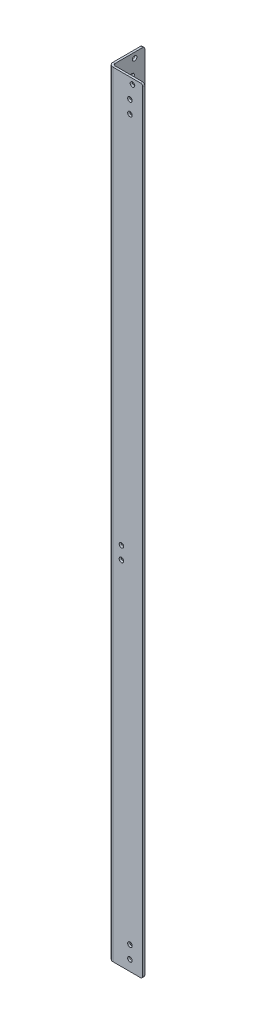
ISO-10303-21;
HEADER;
FILE_DESCRIPTION(('STEP AP214'),'2;1');
FILE_NAME('part.step','',(''),(''),'','','');
FILE_SCHEMA(('AUTOMOTIVE_DESIGN { 1 0 10303 214 1 1 1 1 }'));
ENDSEC;
DATA;
#1=APPLICATION_CONTEXT('core data for automotive mechanical design processes');
#2=APPLICATION_PROTOCOL_DEFINITION('international standard','automotive_design',2000,#1);
#3=PRODUCT_CONTEXT('',#1,'mechanical');
#4=PRODUCT('Part','Part','',(#3));
#5=PRODUCT_RELATED_PRODUCT_CATEGORY('part','',(#4));
#6=PRODUCT_DEFINITION_FORMATION('','',#4);
#7=PRODUCT_DEFINITION_CONTEXT('part definition',#1,'design');
#8=PRODUCT_DEFINITION('design','',#6,#7);
#9=PRODUCT_DEFINITION_SHAPE('','',#8);
#10=(LENGTH_UNIT() NAMED_UNIT(*) SI_UNIT(.MILLI.,.METRE.));
#11=(NAMED_UNIT(*) PLANE_ANGLE_UNIT() SI_UNIT($,.RADIAN.));
#12=(NAMED_UNIT(*) SI_UNIT($,.STERADIAN.) SOLID_ANGLE_UNIT());
#13=UNCERTAINTY_MEASURE_WITH_UNIT(LENGTH_MEASURE(1.E-05),#10,'distance_accuracy_value','');
#14=(GEOMETRIC_REPRESENTATION_CONTEXT(3) GLOBAL_UNCERTAINTY_ASSIGNED_CONTEXT((#13)) GLOBAL_UNIT_ASSIGNED_CONTEXT((#10,
#11,#12)) REPRESENTATION_CONTEXT('',''));
#15=CARTESIAN_POINT('',(0.,0.,0.));
#16=DIRECTION('',(0.,0.,1.));
#17=DIRECTION('',(1.,0.,0.));
#18=AXIS2_PLACEMENT_3D('',#15,#16,#17);
#19=CARTESIAN_POINT('',(0.,1159.383,-6.35));
#20=DIRECTION('',(0.,1.,0.));
#21=DIRECTION('',(0.,0.,1.));
#22=AXIS2_PLACEMENT_3D('',#19,#20,#21);
#23=PLANE('',#22);
#24=DIRECTION('',(1.,0.,0.));
#25=VECTOR('',#24,1.);
#26=CARTESIAN_POINT('',(0.,1159.383,-6.35));
#27=LINE('',#26,#25);
#28=CARTESIAN_POINT('',(0.,1159.383,-6.35));
#29=VERTEX_POINT('',#28);
#30=CARTESIAN_POINT('',(3.175,1159.383,-6.35));
#31=VERTEX_POINT('',#30);
#32=EDGE_CURVE('E293',#29,#31,#27,.T.);
#33=ORIENTED_EDGE('',*,*,#32,.F.);
#34=CARTESIAN_POINT('',(6.35,1159.383,-6.35));
#35=DIRECTION('',(0.,-1.,0.));
#36=DIRECTION('',(0.,0.,-1.));
#37=AXIS2_PLACEMENT_3D('',#34,#35,#36);
#38=CIRCLE('',#37,6.35);
#39=CARTESIAN_POINT('',(6.35,1159.383,0.));
#40=VERTEX_POINT('',#39);
#41=EDGE_CURVE('E290',#29,#40,#38,.F.);
#42=ORIENTED_EDGE('',*,*,#41,.T.);
#43=DIRECTION('',(0.,0.,1.));
#44=VECTOR('',#43,1.);
#45=CARTESIAN_POINT('',(6.35,1159.383,-3.175));
#46=LINE('',#45,#44);
#47=CARTESIAN_POINT('',(6.35,1159.383,-3.175));
#48=VERTEX_POINT('',#47);
#49=EDGE_CURVE('E284',#48,#40,#46,.T.);
#50=ORIENTED_EDGE('',*,*,#49,.F.);
#51=CARTESIAN_POINT('',(6.35,1159.383,-6.35));
#52=DIRECTION('',(0.,1.,0.));
#53=DIRECTION('',(1.,0.,0.));
#54=AXIS2_PLACEMENT_3D('',#51,#52,#53);
#55=CIRCLE('',#54,3.175);
#56=EDGE_CURVE('E288',#31,#48,#55,.T.);
#57=ORIENTED_EDGE('',*,*,#56,.F.);
#58=EDGE_LOOP('',(#33,#42,#50,#57));
#59=FACE_BOUND('',#58,.T.);
#60=ADVANCED_FACE('F192',(#59),#23,.T.);
#61=CARTESIAN_POINT('',(6.35,1159.383,-3.175));
#62=DIRECTION('',(0.,1.,0.));
#63=DIRECTION('',(0.,0.,1.));
#64=AXIS2_PLACEMENT_3D('',#61,#62,#63);
#65=PLANE('',#64);
#66=DIRECTION('',(0.,0.,-1.));
#67=VECTOR('',#66,1.);
#68=CARTESIAN_POINT('',(3.175,1159.383,-50.8));
#69=LINE('',#68,#67);
#70=CARTESIAN_POINT('',(3.175,1159.383,-47.625));
#71=VERTEX_POINT('',#70);
#72=EDGE_CURVE('E320',#71,#31,#69,.F.);
#73=ORIENTED_EDGE('',*,*,#72,.F.);
#74=DIRECTION('',(1.,0.,0.));
#75=VECTOR('',#74,1.);
#76=CARTESIAN_POINT('',(6.35,1159.383,-47.625));
#77=LINE('',#76,#75);
#78=CARTESIAN_POINT('',(0.,1159.383,-47.625));
#79=VERTEX_POINT('',#78);
#80=EDGE_CURVE('E397',#71,#79,#77,.F.);
#81=ORIENTED_EDGE('',*,*,#80,.T.);
#82=DIRECTION('',(0.,0.,1.));
#83=VECTOR('',#82,1.);
#84=CARTESIAN_POINT('',(0.,1159.383,-50.8));
#85=LINE('',#84,#83);
#86=EDGE_CURVE('E324',#79,#29,#85,.T.);
#87=ORIENTED_EDGE('',*,*,#86,.T.);
#88=ORIENTED_EDGE('',*,*,#32,.T.);
#89=EDGE_LOOP('',(#73,#81,#87,#88));
#90=FACE_BOUND('',#89,.T.);
#91=ADVANCED_FACE('F616',(#90),#65,.T.);
#92=CARTESIAN_POINT('',(6.35,0.,0.));
#93=DIRECTION('',(0.,-1.,0.));
#94=DIRECTION('',(0.,0.,-1.));
#95=AXIS2_PLACEMENT_3D('',#92,#93,#94);
#96=PLANE('',#95);
#97=DIRECTION('',(0.,0.,-1.));
#98=VECTOR('',#97,1.);
#99=CARTESIAN_POINT('',(6.35,0.,0.));
#100=LINE('',#99,#98);
#101=CARTESIAN_POINT('',(6.35,0.,0.));
#102=VERTEX_POINT('',#101);
#103=CARTESIAN_POINT('',(6.35,0.,-3.175));
#104=VERTEX_POINT('',#103);
#105=EDGE_CURVE('E294',#102,#104,#100,.T.);
#106=ORIENTED_EDGE('',*,*,#105,.F.);
#107=CARTESIAN_POINT('',(6.35,0.,-6.35));
#108=DIRECTION('',(0.,-1.,0.));
#109=DIRECTION('',(0.,0.,-1.));
#110=AXIS2_PLACEMENT_3D('',#107,#108,#109);
#111=CIRCLE('',#110,6.35);
#112=CARTESIAN_POINT('',(0.,0.,-6.35));
#113=VERTEX_POINT('',#112);
#114=EDGE_CURVE('E349',#113,#102,#111,.F.);
#115=ORIENTED_EDGE('',*,*,#114,.F.);
#116=DIRECTION('',(-1.,0.,0.));
#117=VECTOR('',#116,1.);
#118=CARTESIAN_POINT('',(3.175,0.,-6.35));
#119=LINE('',#118,#117);
#120=CARTESIAN_POINT('',(3.175,0.,-6.35));
#121=VERTEX_POINT('',#120);
#122=EDGE_CURVE('E375',#121,#113,#119,.T.);
#123=ORIENTED_EDGE('',*,*,#122,.F.);
#124=CARTESIAN_POINT('',(6.35,0.,-6.35));
#125=DIRECTION('',(0.,1.,0.));
#126=DIRECTION('',(1.,0.,0.));
#127=AXIS2_PLACEMENT_3D('',#124,#125,#126);
#128=CIRCLE('',#127,3.175);
#129=EDGE_CURVE('E340',#121,#104,#128,.T.);
#130=ORIENTED_EDGE('',*,*,#129,.T.);
#131=EDGE_LOOP('',(#106,#115,#123,#130));
#132=FACE_BOUND('',#131,.T.);
#133=ADVANCED_FACE('F614',(#132),#96,.T.);
#134=CARTESIAN_POINT('',(3.175,0.,-6.35));
#135=DIRECTION('',(0.,-1.,0.));
#136=DIRECTION('',(0.,0.,-1.));
#137=AXIS2_PLACEMENT_3D('',#134,#135,#136);
#138=PLANE('',#137);
#139=DIRECTION('',(1.,0.,0.));
#140=VECTOR('',#139,1.);
#141=CARTESIAN_POINT('',(0.,0.,-3.175));
#142=LINE('',#141,#140);
#143=CARTESIAN_POINT('',(47.625,0.,-3.175));
#144=VERTEX_POINT('',#143);
#145=EDGE_CURVE('E304',#104,#144,#142,.T.);
#146=ORIENTED_EDGE('',*,*,#145,.T.);
#147=DIRECTION('',(0.,0.,1.));
#148=VECTOR('',#147,1.);
#149=CARTESIAN_POINT('',(47.625,0.,-6.35));
#150=LINE('',#149,#148);
#151=CARTESIAN_POINT('',(47.625,0.,0.));
#152=VERTEX_POINT('',#151);
#153=EDGE_CURVE('E410',#144,#152,#150,.T.);
#154=ORIENTED_EDGE('',*,*,#153,.T.);
#155=DIRECTION('',(1.,0.,0.));
#156=VECTOR('',#155,1.);
#157=CARTESIAN_POINT('',(0.,0.,0.));
#158=LINE('',#157,#156);
#159=EDGE_CURVE('E333',#102,#152,#158,.T.);
#160=ORIENTED_EDGE('',*,*,#159,.F.);
#161=ORIENTED_EDGE('',*,*,#105,.T.);
#162=EDGE_LOOP('',(#146,#154,#160,#161));
#163=FACE_BOUND('',#162,.T.);
#164=ADVANCED_FACE('F434',(#163),#138,.T.);
#165=CARTESIAN_POINT('',(0.,1159.383,0.));
#166=DIRECTION('',(0.,0.,-1.));
#167=DIRECTION('',(-1.,0.,0.));
#168=AXIS2_PLACEMENT_3D('',#165,#166,#167);
#169=PLANE('',#168);
#170=CARTESIAN_POINT('',(31.75,1130.173,0.));
#171=DIRECTION('',(0.,0.,1.));
#172=DIRECTION('',(1.,0.,0.));
#173=AXIS2_PLACEMENT_3D('',#170,#171,#172);
#174=CIRCLE('',#173,3.42899999999998);
#175=CARTESIAN_POINT('',(35.179,1130.173,0.));
#176=VERTEX_POINT('',#175);
#177=EDGE_CURVE('E471',#176,#176,#174,.T.);
#178=ORIENTED_EDGE('',*,*,#177,.F.);
#179=EDGE_LOOP('',(#178));
#180=FACE_BOUND('',#179,.T.);
#181=CARTESIAN_POINT('',(19.05,527.05,0.));
#182=DIRECTION('',(0.,0.,1.));
#183=DIRECTION('',(1.,0.,0.));
#184=AXIS2_PLACEMENT_3D('',#181,#182,#183);
#185=CIRCLE('',#184,3.429);
#186=CARTESIAN_POINT('',(22.479,527.05,0.));
#187=VERTEX_POINT('',#186);
#188=EDGE_CURVE('E480',#187,#187,#185,.T.);
#189=ORIENTED_EDGE('',*,*,#188,.F.);
#190=EDGE_LOOP('',(#189));
#191=FACE_BOUND('',#190,.T.);
#192=CARTESIAN_POINT('',(19.05,546.1,0.));
#193=DIRECTION('',(0.,0.,1.));
#194=DIRECTION('',(1.,0.,0.));
#195=AXIS2_PLACEMENT_3D('',#192,#193,#194);
#196=CIRCLE('',#195,3.429);
#197=CARTESIAN_POINT('',(22.479,546.1,0.));
#198=VERTEX_POINT('',#197);
#199=EDGE_CURVE('E455',#198,#198,#196,.T.);
#200=ORIENTED_EDGE('',*,*,#199,.F.);
#201=EDGE_LOOP('',(#200));
#202=FACE_BOUND('',#201,.T.);
#203=CARTESIAN_POINT('',(31.75,15.875,0.));
#204=DIRECTION('',(0.,0.,1.));
#205=DIRECTION('',(1.,0.,0.));
#206=AXIS2_PLACEMENT_3D('',#203,#204,#205);
#207=CIRCLE('',#206,3.429);
#208=CARTESIAN_POINT('',(35.179,15.875,0.));
#209=VERTEX_POINT('',#208);
#210=EDGE_CURVE('E464',#209,#209,#207,.T.);
#211=ORIENTED_EDGE('',*,*,#210,.F.);
#212=EDGE_LOOP('',(#211));
#213=FACE_BOUND('',#212,.T.);
#214=CARTESIAN_POINT('',(31.75,1111.123,0.));
#215=DIRECTION('',(0.,0.,1.));
#216=DIRECTION('',(1.,0.,0.));
#217=AXIS2_PLACEMENT_3D('',#214,#215,#216);
#218=CIRCLE('',#217,3.42899999999998);
#219=CARTESIAN_POINT('',(35.179,1111.123,0.));
#220=VERTEX_POINT('',#219);
#221=EDGE_CURVE('E496',#220,#220,#218,.T.);
#222=ORIENTED_EDGE('',*,*,#221,.F.);
#223=EDGE_LOOP('',(#222));
#224=FACE_BOUND('',#223,.T.);
#225=CARTESIAN_POINT('',(35.56,1151.4455,0.));
#226=DIRECTION('',(0.,0.,1.));
#227=DIRECTION('',(1.,0.,0.));
#228=AXIS2_PLACEMENT_3D('',#225,#226,#227);
#229=CIRCLE('',#228,3.42899999999999);
#230=CARTESIAN_POINT('',(38.989,1151.4455,0.));
#231=VERTEX_POINT('',#230);
#232=EDGE_CURVE('E487',#231,#231,#229,.T.);
#233=ORIENTED_EDGE('',*,*,#232,.F.);
#234=EDGE_LOOP('',(#233));
#235=FACE_BOUND('',#234,.T.);
#236=CARTESIAN_POINT('',(31.75,34.925,0.));
#237=DIRECTION('',(0.,0.,1.));
#238=DIRECTION('',(1.,0.,0.));
#239=AXIS2_PLACEMENT_3D('',#236,#237,#238);
#240=CIRCLE('',#239,3.429);
#241=CARTESIAN_POINT('',(35.179,34.925,0.));
#242=VERTEX_POINT('',#241);
#243=EDGE_CURVE('E447',#242,#242,#240,.T.);
#244=ORIENTED_EDGE('',*,*,#243,.F.);
#245=EDGE_LOOP('',(#244));
#246=FACE_BOUND('',#245,.T.);
#247=ORIENTED_EDGE('',*,*,#159,.T.);
#248=CARTESIAN_POINT('',(47.625,3.175,0.));
#249=DIRECTION('',(0.,0.,-1.));
#250=DIRECTION('',(-1.,0.,0.));
#251=AXIS2_PLACEMENT_3D('',#248,#249,#250);
#252=CIRCLE('',#251,3.175);
#253=CARTESIAN_POINT('',(50.8,3.17499999999993,0.));
#254=VERTEX_POINT('',#253);
#255=EDGE_CURVE('E417',#152,#254,#252,.F.);
#256=ORIENTED_EDGE('',*,*,#255,.T.);
#257=DIRECTION('',(0.,-1.,0.));
#258=VECTOR('',#257,1.);
#259=CARTESIAN_POINT('',(50.8,1159.383,0.));
#260=LINE('',#259,#258);
#261=CARTESIAN_POINT('',(50.8,1156.208,0.));
#262=VERTEX_POINT('',#261);
#263=EDGE_CURVE('E372',#262,#254,#260,.T.);
#264=ORIENTED_EDGE('',*,*,#263,.F.);
#265=CARTESIAN_POINT('',(47.625,1156.208,0.));
#266=DIRECTION('',(0.,0.,-1.));
#267=DIRECTION('',(-1.,0.,0.));
#268=AXIS2_PLACEMENT_3D('',#265,#266,#267);
#269=CIRCLE('',#268,3.175);
#270=CARTESIAN_POINT('',(47.625,1159.383,0.));
#271=VERTEX_POINT('',#270);
#272=EDGE_CURVE('E414',#262,#271,#269,.F.);
#273=ORIENTED_EDGE('',*,*,#272,.T.);
#274=DIRECTION('',(1.,0.,0.));
#275=VECTOR('',#274,1.);
#276=CARTESIAN_POINT('',(0.,1159.383,0.));
#277=LINE('',#276,#275);
#278=EDGE_CURVE('E314',#40,#271,#277,.T.);
#279=ORIENTED_EDGE('',*,*,#278,.F.);
#280=DIRECTION('',(0.,-1.,0.));
#281=VECTOR('',#280,1.);
#282=CARTESIAN_POINT('',(6.35,1159.383,0.));
#283=LINE('',#282,#281);
#284=EDGE_CURVE('E332',#40,#102,#283,.T.);
#285=ORIENTED_EDGE('',*,*,#284,.T.);
#286=EDGE_LOOP('',(#247,#256,#264,#273,#279,#285));
#287=FACE_BOUND('',#286,.T.);
#288=ADVANCED_FACE('F439',(#180,#191,#202,#213,#224,#235,#246,#287),#169,.F.);
#289=CARTESIAN_POINT('',(50.8,1159.383,-3.175));
#290=DIRECTION('',(1.,0.,0.));
#291=DIRECTION('',(0.,0.,-1.));
#292=AXIS2_PLACEMENT_3D('',#289,#290,#291);
#293=PLANE('',#292);
#294=ORIENTED_EDGE('',*,*,#263,.T.);
#295=DIRECTION('',(0.,0.,1.));
#296=VECTOR('',#295,1.);
#297=CARTESIAN_POINT('',(50.8,3.17499999999993,-3.175));
#298=LINE('',#297,#296);
#299=CARTESIAN_POINT('',(50.8,3.17499999999993,-3.175));
#300=VERTEX_POINT('',#299);
#301=EDGE_CURVE('E214',#254,#300,#298,.F.);
#302=ORIENTED_EDGE('',*,*,#301,.T.);
#303=DIRECTION('',(0.,-1.,0.));
#304=VECTOR('',#303,1.);
#305=CARTESIAN_POINT('',(50.8,1159.383,-3.175));
#306=LINE('',#305,#304);
#307=CARTESIAN_POINT('',(50.8,1156.208,-3.175));
#308=VERTEX_POINT('',#307);
#309=EDGE_CURVE('E309',#308,#300,#306,.T.);
#310=ORIENTED_EDGE('',*,*,#309,.F.);
#311=DIRECTION('',(0.,0.,1.));
#312=VECTOR('',#311,1.);
#313=CARTESIAN_POINT('',(50.8,1156.208,-3.175));
#314=LINE('',#313,#312);
#315=EDGE_CURVE('E420',#308,#262,#314,.T.);
#316=ORIENTED_EDGE('',*,*,#315,.T.);
#317=EDGE_LOOP('',(#294,#302,#310,#316));
#318=FACE_BOUND('',#317,.T.);
#319=ADVANCED_FACE('F440',(#318),#293,.T.);
#320=CARTESIAN_POINT('',(0.,1159.383,-3.175));
#321=DIRECTION('',(0.,0.,-1.));
#322=DIRECTION('',(-1.,0.,0.));
#323=AXIS2_PLACEMENT_3D('',#320,#321,#322);
#324=PLANE('',#323);
#325=CARTESIAN_POINT('',(31.75,1130.173,-3.175));
#326=DIRECTION('',(0.,0.,1.));
#327=DIRECTION('',(1.,0.,0.));
#328=AXIS2_PLACEMENT_3D('',#325,#326,#327);
#329=CIRCLE('',#328,3.42899999999998);
#330=CARTESIAN_POINT('',(35.179,1130.173,-3.175));
#331=VERTEX_POINT('',#330);
#332=EDGE_CURVE('E475',#331,#331,#329,.T.);
#333=ORIENTED_EDGE('',*,*,#332,.T.);
#334=EDGE_LOOP('',(#333));
#335=FACE_BOUND('',#334,.T.);
#336=CARTESIAN_POINT('',(19.05,527.05,-3.175));
#337=DIRECTION('',(0.,0.,1.));
#338=DIRECTION('',(1.,0.,0.));
#339=AXIS2_PLACEMENT_3D('',#336,#337,#338);
#340=CIRCLE('',#339,3.429);
#341=CARTESIAN_POINT('',(22.479,527.05,-3.175));
#342=VERTEX_POINT('',#341);
#343=EDGE_CURVE('E460',#342,#342,#340,.T.);
#344=ORIENTED_EDGE('',*,*,#343,.T.);
#345=EDGE_LOOP('',(#344));
#346=FACE_BOUND('',#345,.T.);
#347=CARTESIAN_POINT('',(19.05,546.1,-3.175));
#348=DIRECTION('',(0.,0.,1.));
#349=DIRECTION('',(1.,0.,0.));
#350=AXIS2_PLACEMENT_3D('',#347,#348,#349);
#351=CIRCLE('',#350,3.429);
#352=CARTESIAN_POINT('',(22.479,546.1,-3.175));
#353=VERTEX_POINT('',#352);
#354=EDGE_CURVE('E459',#353,#353,#351,.T.);
#355=ORIENTED_EDGE('',*,*,#354,.T.);
#356=EDGE_LOOP('',(#355));
#357=FACE_BOUND('',#356,.T.);
#358=CARTESIAN_POINT('',(31.75,15.875,-3.175));
#359=DIRECTION('',(0.,0.,1.));
#360=DIRECTION('',(1.,0.,0.));
#361=AXIS2_PLACEMENT_3D('',#358,#359,#360);
#362=CIRCLE('',#361,3.429);
#363=CARTESIAN_POINT('',(35.179,15.875,-3.175));
#364=VERTEX_POINT('',#363);
#365=EDGE_CURVE('E451',#364,#364,#362,.T.);
#366=ORIENTED_EDGE('',*,*,#365,.T.);
#367=EDGE_LOOP('',(#366));
#368=FACE_BOUND('',#367,.T.);
#369=CARTESIAN_POINT('',(31.75,1111.123,-3.175));
#370=DIRECTION('',(0.,0.,1.));
#371=DIRECTION('',(1.,0.,0.));
#372=AXIS2_PLACEMENT_3D('',#369,#370,#371);
#373=CIRCLE('',#372,3.42899999999998);
#374=CARTESIAN_POINT('',(35.179,1111.123,-3.175));
#375=VERTEX_POINT('',#374);
#376=EDGE_CURVE('E476',#375,#375,#373,.T.);
#377=ORIENTED_EDGE('',*,*,#376,.T.);
#378=EDGE_LOOP('',(#377));
#379=FACE_BOUND('',#378,.T.);
#380=CARTESIAN_POINT('',(35.56,1151.4455,-3.175));
#381=DIRECTION('',(0.,0.,1.));
#382=DIRECTION('',(1.,0.,0.));
#383=AXIS2_PLACEMENT_3D('',#380,#381,#382);
#384=CIRCLE('',#383,3.42899999999999);
#385=CARTESIAN_POINT('',(38.989,1151.4455,-3.175));
#386=VERTEX_POINT('',#385);
#387=EDGE_CURVE('E491',#386,#386,#384,.T.);
#388=ORIENTED_EDGE('',*,*,#387,.T.);
#389=EDGE_LOOP('',(#388));
#390=FACE_BOUND('',#389,.T.);
#391=CARTESIAN_POINT('',(31.75,34.925,-3.175));
#392=DIRECTION('',(0.,0.,1.));
#393=DIRECTION('',(1.,0.,0.));
#394=AXIS2_PLACEMENT_3D('',#391,#392,#393);
#395=CIRCLE('',#394,3.429);
#396=CARTESIAN_POINT('',(35.179,34.925,-3.175));
#397=VERTEX_POINT('',#396);
#398=EDGE_CURVE('E337',#397,#397,#395,.T.);
#399=ORIENTED_EDGE('',*,*,#398,.T.);
#400=EDGE_LOOP('',(#399));
#401=FACE_BOUND('',#400,.T.);
#402=ORIENTED_EDGE('',*,*,#309,.T.);
#403=CARTESIAN_POINT('',(47.625,3.175,-3.175));
#404=DIRECTION('',(0.,0.,-1.));
#405=DIRECTION('',(-1.,0.,0.));
#406=AXIS2_PLACEMENT_3D('',#403,#404,#405);
#407=CIRCLE('',#406,3.175);
#408=EDGE_CURVE('E201',#300,#144,#407,.T.);
#409=ORIENTED_EDGE('',*,*,#408,.T.);
#410=ORIENTED_EDGE('',*,*,#145,.F.);
#411=DIRECTION('',(0.,-1.,0.));
#412=VECTOR('',#411,1.);
#413=CARTESIAN_POINT('',(6.35,1159.383,-3.175));
#414=LINE('',#413,#412);
#415=EDGE_CURVE('E299',#48,#104,#414,.T.);
#416=ORIENTED_EDGE('',*,*,#415,.F.);
#417=DIRECTION('',(1.,0.,0.));
#418=VECTOR('',#417,1.);
#419=CARTESIAN_POINT('',(0.,1159.383,-3.175));
#420=LINE('',#419,#418);
#421=CARTESIAN_POINT('',(47.625,1159.383,-3.175));
#422=VERTEX_POINT('',#421);
#423=EDGE_CURVE('E301',#48,#422,#420,.T.);
#424=ORIENTED_EDGE('',*,*,#423,.T.);
#425=CARTESIAN_POINT('',(47.625,1156.208,-3.175));
#426=DIRECTION('',(0.,0.,-1.));
#427=DIRECTION('',(-1.,0.,0.));
#428=AXIS2_PLACEMENT_3D('',#425,#426,#427);
#429=CIRCLE('',#428,3.175);
#430=EDGE_CURVE('E426',#422,#308,#429,.T.);
#431=ORIENTED_EDGE('',*,*,#430,.T.);
#432=EDGE_LOOP('',(#402,#409,#410,#416,#424,#431));
#433=FACE_BOUND('',#432,.T.);
#434=ADVANCED_FACE('F300',(#335,#346,#357,#368,#379,#390,#401,#433),#324,.T.);
#435=CARTESIAN_POINT('',(6.35,1159.383,-6.35));
#436=DIRECTION('',(0.,-1.,0.));
#437=DIRECTION('',(0.,0.,-1.));
#438=AXIS2_PLACEMENT_3D('',#435,#436,#437);
#439=CYLINDRICAL_SURFACE('',#438,3.175);
#440=ORIENTED_EDGE('',*,*,#129,.F.);
#441=DIRECTION('',(0.,-1.,0.));
#442=VECTOR('',#441,1.);
#443=CARTESIAN_POINT('',(3.175,1159.383,-6.35));
#444=LINE('',#443,#442);
#445=EDGE_CURVE('E310',#31,#121,#444,.T.);
#446=ORIENTED_EDGE('',*,*,#445,.F.);
#447=ORIENTED_EDGE('',*,*,#56,.T.);
#448=ORIENTED_EDGE('',*,*,#415,.T.);
#449=EDGE_LOOP('',(#440,#446,#447,#448));
#450=FACE_BOUND('',#449,.T.);
#451=ADVANCED_FACE('F317',(#450),#439,.F.);
#452=CARTESIAN_POINT('',(3.175,1159.383,-50.8));
#453=DIRECTION('',(1.,0.,0.));
#454=DIRECTION('',(0.,0.,-1.));
#455=AXIS2_PLACEMENT_3D('',#452,#453,#454);
#456=PLANE('',#455);
#457=CARTESIAN_POINT('',(3.175,1151.4455,-35.56));
#458=DIRECTION('',(-1.,0.,0.));
#459=DIRECTION('',(0.,0.,1.));
#460=AXIS2_PLACEMENT_3D('',#457,#458,#459);
#461=CIRCLE('',#460,3.42899999999999);
#462=CARTESIAN_POINT('',(3.175,1151.4455,-32.131));
#463=VERTEX_POINT('',#462);
#464=EDGE_CURVE('E492',#463,#463,#461,.T.);
#465=ORIENTED_EDGE('',*,*,#464,.T.);
#466=EDGE_LOOP('',(#465));
#467=FACE_BOUND('',#466,.T.);
#468=CARTESIAN_POINT('',(3.175,34.925,-31.75));
#469=DIRECTION('',(-1.,0.,0.));
#470=DIRECTION('',(0.,0.,1.));
#471=AXIS2_PLACEMENT_3D('',#468,#469,#470);
#472=CIRCLE('',#471,3.429);
#473=CARTESIAN_POINT('',(3.175,34.925,-28.321));
#474=VERTEX_POINT('',#473);
#475=EDGE_CURVE('E547',#474,#474,#472,.T.);
#476=ORIENTED_EDGE('',*,*,#475,.T.);
#477=EDGE_LOOP('',(#476));
#478=FACE_BOUND('',#477,.T.);
#479=CARTESIAN_POINT('',(3.175,15.875,-31.75));
#480=DIRECTION('',(-1.,0.,0.));
#481=DIRECTION('',(0.,0.,1.));
#482=AXIS2_PLACEMENT_3D('',#479,#480,#481);
#483=CIRCLE('',#482,3.429);
#484=CARTESIAN_POINT('',(3.175,15.875,-28.321));
#485=VERTEX_POINT('',#484);
#486=EDGE_CURVE('E539',#485,#485,#483,.T.);
#487=ORIENTED_EDGE('',*,*,#486,.T.);
#488=EDGE_LOOP('',(#487));
#489=FACE_BOUND('',#488,.T.);
#490=CARTESIAN_POINT('',(3.175,546.1,-19.05));
#491=DIRECTION('',(-1.,0.,0.));
#492=DIRECTION('',(0.,0.,1.));
#493=AXIS2_PLACEMENT_3D('',#490,#491,#492);
#494=CIRCLE('',#493,3.42899999999999);
#495=CARTESIAN_POINT('',(3.175,546.1,-15.621));
#496=VERTEX_POINT('',#495);
#497=EDGE_CURVE('E531',#496,#496,#494,.T.);
#498=ORIENTED_EDGE('',*,*,#497,.T.);
#499=EDGE_LOOP('',(#498));
#500=FACE_BOUND('',#499,.T.);
#501=CARTESIAN_POINT('',(3.175,527.05,-19.05));
#502=DIRECTION('',(-1.,0.,0.));
#503=DIRECTION('',(0.,0.,1.));
#504=AXIS2_PLACEMENT_3D('',#501,#502,#503);
#505=CIRCLE('',#504,3.42899999999999);
#506=CARTESIAN_POINT('',(3.175,527.05,-15.621));
#507=VERTEX_POINT('',#506);
#508=EDGE_CURVE('E523',#507,#507,#505,.T.);
#509=ORIENTED_EDGE('',*,*,#508,.T.);
#510=EDGE_LOOP('',(#509));
#511=FACE_BOUND('',#510,.T.);
#512=CARTESIAN_POINT('',(3.175,1130.173,-31.75));
#513=DIRECTION('',(-1.,0.,0.));
#514=DIRECTION('',(0.,0.,1.));
#515=AXIS2_PLACEMENT_3D('',#512,#513,#514);
#516=CIRCLE('',#515,3.429);
#517=CARTESIAN_POINT('',(3.175,1130.173,-28.321));
#518=VERTEX_POINT('',#517);
#519=EDGE_CURVE('E515',#518,#518,#516,.T.);
#520=ORIENTED_EDGE('',*,*,#519,.T.);
#521=EDGE_LOOP('',(#520));
#522=FACE_BOUND('',#521,.T.);
#523=CARTESIAN_POINT('',(3.175,1111.123,-31.75));
#524=DIRECTION('',(-1.,0.,0.));
#525=DIRECTION('',(0.,0.,1.));
#526=AXIS2_PLACEMENT_3D('',#523,#524,#525);
#527=CIRCLE('',#526,3.429);
#528=CARTESIAN_POINT('',(3.175,1111.123,-28.321));
#529=VERTEX_POINT('',#528);
#530=EDGE_CURVE('E507',#529,#529,#527,.T.);
#531=ORIENTED_EDGE('',*,*,#530,.T.);
#532=EDGE_LOOP('',(#531));
#533=FACE_BOUND('',#532,.T.);
#534=DIRECTION('',(0.,-1.,0.));
#535=VECTOR('',#534,1.);
#536=CARTESIAN_POINT('',(3.175,1159.383,-50.8));
#537=LINE('',#536,#535);
#538=CARTESIAN_POINT('',(3.175,1156.208,-50.8));
#539=VERTEX_POINT('',#538);
#540=CARTESIAN_POINT('',(3.175,3.17499999999993,-50.8));
#541=VERTEX_POINT('',#540);
#542=EDGE_CURVE('E364',#539,#541,#537,.T.);
#543=ORIENTED_EDGE('',*,*,#542,.F.);
#544=CARTESIAN_POINT('',(3.175,1156.208,-47.625));
#545=DIRECTION('',(1.,0.,0.));
#546=DIRECTION('',(0.,0.,-1.));
#547=AXIS2_PLACEMENT_3D('',#544,#545,#546);
#548=CIRCLE('',#547,3.175);
#549=EDGE_CURVE('E394',#539,#71,#548,.T.);
#550=ORIENTED_EDGE('',*,*,#549,.T.);
#551=ORIENTED_EDGE('',*,*,#72,.T.);
#552=ORIENTED_EDGE('',*,*,#445,.T.);
#553=DIRECTION('',(0.,0.,-1.));
#554=VECTOR('',#553,1.);
#555=CARTESIAN_POINT('',(3.175,0.,-50.8));
#556=LINE('',#555,#554);
#557=CARTESIAN_POINT('',(3.175,0.,-47.625));
#558=VERTEX_POINT('',#557);
#559=EDGE_CURVE('E343',#558,#121,#556,.F.);
#560=ORIENTED_EDGE('',*,*,#559,.F.);
#561=CARTESIAN_POINT('',(3.175,3.175,-47.625));
#562=DIRECTION('',(1.,0.,0.));
#563=DIRECTION('',(0.,0.,-1.));
#564=AXIS2_PLACEMENT_3D('',#561,#562,#563);
#565=CIRCLE('',#564,3.175);
#566=EDGE_CURVE('E391',#558,#541,#565,.T.);
#567=ORIENTED_EDGE('',*,*,#566,.T.);
#568=EDGE_LOOP('',(#543,#550,#551,#552,#560,#567));
#569=FACE_BOUND('',#568,.T.);
#570=ADVANCED_FACE('F560',(#467,#478,#489,#500,#511,#522,#533,#569),#456,.T.);
#571=CARTESIAN_POINT('',(0.,1159.383,-50.8));
#572=DIRECTION('',(0.,0.,-1.));
#573=DIRECTION('',(-1.,0.,0.));
#574=AXIS2_PLACEMENT_3D('',#571,#572,#573);
#575=PLANE('',#574);
#576=DIRECTION('',(0.,-1.,0.));
#577=VECTOR('',#576,1.);
#578=CARTESIAN_POINT('',(0.,1159.383,-50.8));
#579=LINE('',#578,#577);
#580=CARTESIAN_POINT('',(0.,1156.208,-50.8));
#581=VERTEX_POINT('',#580);
#582=CARTESIAN_POINT('',(0.,3.17499999999993,-50.8));
#583=VERTEX_POINT('',#582);
#584=EDGE_CURVE('E360',#581,#583,#579,.T.);
#585=ORIENTED_EDGE('',*,*,#584,.F.);
#586=DIRECTION('',(1.,0.,0.));
#587=VECTOR('',#586,1.);
#588=CARTESIAN_POINT('',(0.,1156.208,-50.8));
#589=LINE('',#588,#587);
#590=EDGE_CURVE('E387',#581,#539,#589,.T.);
#591=ORIENTED_EDGE('',*,*,#590,.T.);
#592=ORIENTED_EDGE('',*,*,#542,.T.);
#593=DIRECTION('',(1.,0.,0.));
#594=VECTOR('',#593,1.);
#595=CARTESIAN_POINT('',(0.,3.175,-50.8));
#596=LINE('',#595,#594);
#597=EDGE_CURVE('E384',#541,#583,#596,.F.);
#598=ORIENTED_EDGE('',*,*,#597,.T.);
#599=EDGE_LOOP('',(#585,#591,#592,#598));
#600=FACE_BOUND('',#599,.T.);
#601=ADVANCED_FACE('F575',(#600),#575,.T.);
#602=CARTESIAN_POINT('',(0.,1159.383,-50.8));
#603=DIRECTION('',(1.,0.,0.));
#604=DIRECTION('',(0.,0.,-1.));
#605=AXIS2_PLACEMENT_3D('',#602,#603,#604);
#606=PLANE('',#605);
#607=CARTESIAN_POINT('',(0.,1151.4455,-35.56));
#608=DIRECTION('',(-1.,0.,0.));
#609=DIRECTION('',(0.,0.,1.));
#610=AXIS2_PLACEMENT_3D('',#607,#608,#609);
#611=CIRCLE('',#610,3.42899999999999);
#612=CARTESIAN_POINT('',(0.,1151.4455,-32.131));
#613=VERTEX_POINT('',#612);
#614=EDGE_CURVE('E551',#613,#613,#611,.T.);
#615=ORIENTED_EDGE('',*,*,#614,.F.);
#616=EDGE_LOOP('',(#615));
#617=FACE_BOUND('',#616,.T.);
#618=CARTESIAN_POINT('',(0.,34.925,-31.75));
#619=DIRECTION('',(-1.,0.,0.));
#620=DIRECTION('',(0.,0.,1.));
#621=AXIS2_PLACEMENT_3D('',#618,#619,#620);
#622=CIRCLE('',#621,3.429);
#623=CARTESIAN_POINT('',(0.,34.925,-28.321));
#624=VERTEX_POINT('',#623);
#625=EDGE_CURVE('E543',#624,#624,#622,.T.);
#626=ORIENTED_EDGE('',*,*,#625,.F.);
#627=EDGE_LOOP('',(#626));
#628=FACE_BOUND('',#627,.T.);
#629=CARTESIAN_POINT('',(0.,15.875,-31.75));
#630=DIRECTION('',(-1.,0.,0.));
#631=DIRECTION('',(0.,0.,1.));
#632=AXIS2_PLACEMENT_3D('',#629,#630,#631);
#633=CIRCLE('',#632,3.429);
#634=CARTESIAN_POINT('',(0.,15.875,-28.321));
#635=VERTEX_POINT('',#634);
#636=EDGE_CURVE('E535',#635,#635,#633,.T.);
#637=ORIENTED_EDGE('',*,*,#636,.F.);
#638=EDGE_LOOP('',(#637));
#639=FACE_BOUND('',#638,.T.);
#640=CARTESIAN_POINT('',(0.,546.1,-19.05));
#641=DIRECTION('',(-1.,0.,0.));
#642=DIRECTION('',(0.,0.,1.));
#643=AXIS2_PLACEMENT_3D('',#640,#641,#642);
#644=CIRCLE('',#643,3.42899999999999);
#645=CARTESIAN_POINT('',(0.,546.1,-15.621));
#646=VERTEX_POINT('',#645);
#647=EDGE_CURVE('E527',#646,#646,#644,.T.);
#648=ORIENTED_EDGE('',*,*,#647,.F.);
#649=EDGE_LOOP('',(#648));
#650=FACE_BOUND('',#649,.T.);
#651=CARTESIAN_POINT('',(0.,527.05,-19.05));
#652=DIRECTION('',(-1.,0.,0.));
#653=DIRECTION('',(0.,0.,1.));
#654=AXIS2_PLACEMENT_3D('',#651,#652,#653);
#655=CIRCLE('',#654,3.42899999999999);
#656=CARTESIAN_POINT('',(0.,527.05,-15.621));
#657=VERTEX_POINT('',#656);
#658=EDGE_CURVE('E519',#657,#657,#655,.T.);
#659=ORIENTED_EDGE('',*,*,#658,.F.);
#660=EDGE_LOOP('',(#659));
#661=FACE_BOUND('',#660,.T.);
#662=CARTESIAN_POINT('',(0.,1130.173,-31.75));
#663=DIRECTION('',(-1.,0.,0.));
#664=DIRECTION('',(0.,0.,1.));
#665=AXIS2_PLACEMENT_3D('',#662,#663,#664);
#666=CIRCLE('',#665,3.429);
#667=CARTESIAN_POINT('',(0.,1130.173,-28.321));
#668=VERTEX_POINT('',#667);
#669=EDGE_CURVE('E511',#668,#668,#666,.T.);
#670=ORIENTED_EDGE('',*,*,#669,.F.);
#671=EDGE_LOOP('',(#670));
#672=FACE_BOUND('',#671,.T.);
#673=CARTESIAN_POINT('',(0.,1111.123,-31.75));
#674=DIRECTION('',(-1.,0.,0.));
#675=DIRECTION('',(0.,0.,1.));
#676=AXIS2_PLACEMENT_3D('',#673,#674,#675);
#677=CIRCLE('',#676,3.429);
#678=CARTESIAN_POINT('',(0.,1111.123,-28.321));
#679=VERTEX_POINT('',#678);
#680=EDGE_CURVE('E503',#679,#679,#677,.T.);
#681=ORIENTED_EDGE('',*,*,#680,.F.);
#682=EDGE_LOOP('',(#681));
#683=FACE_BOUND('',#682,.T.);
#684=ORIENTED_EDGE('',*,*,#86,.F.);
#685=CARTESIAN_POINT('',(0.,1156.208,-47.625));
#686=DIRECTION('',(1.,0.,0.));
#687=DIRECTION('',(0.,0.,-1.));
#688=AXIS2_PLACEMENT_3D('',#685,#686,#687);
#689=CIRCLE('',#688,3.175);
#690=EDGE_CURVE('E403',#79,#581,#689,.F.);
#691=ORIENTED_EDGE('',*,*,#690,.T.);
#692=ORIENTED_EDGE('',*,*,#584,.T.);
#693=CARTESIAN_POINT('',(0.,3.175,-47.625));
#694=DIRECTION('',(1.,0.,0.));
#695=DIRECTION('',(0.,0.,-1.));
#696=AXIS2_PLACEMENT_3D('',#693,#694,#695);
#697=CIRCLE('',#696,3.175);
#698=CARTESIAN_POINT('',(0.,0.,-47.625));
#699=VERTEX_POINT('',#698);
#700=EDGE_CURVE('E400',#583,#699,#697,.F.);
#701=ORIENTED_EDGE('',*,*,#700,.T.);
#702=DIRECTION('',(0.,0.,1.));
#703=VECTOR('',#702,1.);
#704=CARTESIAN_POINT('',(0.,0.,-50.8));
#705=LINE('',#704,#703);
#706=EDGE_CURVE('E346',#699,#113,#705,.T.);
#707=ORIENTED_EDGE('',*,*,#706,.T.);
#708=DIRECTION('',(0.,-1.,0.));
#709=VECTOR('',#708,1.);
#710=CARTESIAN_POINT('',(0.,1159.383,-6.35));
#711=LINE('',#710,#709);
#712=EDGE_CURVE('E356',#29,#113,#711,.T.);
#713=ORIENTED_EDGE('',*,*,#712,.F.);
#714=EDGE_LOOP('',(#684,#691,#692,#701,#707,#713));
#715=FACE_BOUND('',#714,.T.);
#716=ADVANCED_FACE('F571',(#617,#628,#639,#650,#661,#672,#683,#715),#606,.F.);
#717=CARTESIAN_POINT('',(6.35,1159.383,-6.35));
#718=DIRECTION('',(0.,-1.,0.));
#719=DIRECTION('',(0.,0.,-1.));
#720=AXIS2_PLACEMENT_3D('',#717,#718,#719);
#721=CYLINDRICAL_SURFACE('',#720,6.35);
#722=ORIENTED_EDGE('',*,*,#114,.T.);
#723=ORIENTED_EDGE('',*,*,#284,.F.);
#724=ORIENTED_EDGE('',*,*,#41,.F.);
#725=ORIENTED_EDGE('',*,*,#712,.T.);
#726=EDGE_LOOP('',(#722,#723,#724,#725));
#727=FACE_BOUND('',#726,.T.);
#728=ADVANCED_FACE('F574',(#727),#721,.T.);
#729=CARTESIAN_POINT('',(6.35,1159.383,-6.35));
#730=DIRECTION('',(0.,1.,0.));
#731=DIRECTION('',(1.,0.,0.));
#732=AXIS2_PLACEMENT_3D('',#729,#730,#731);
#733=PLANE('',#732);
#734=ORIENTED_EDGE('',*,*,#278,.T.);
#735=DIRECTION('',(0.,0.,1.));
#736=VECTOR('',#735,1.);
#737=CARTESIAN_POINT('',(47.625,1159.383,-6.35));
#738=LINE('',#737,#736);
#739=EDGE_CURVE('E12',#271,#422,#738,.F.);
#740=ORIENTED_EDGE('',*,*,#739,.T.);
#741=ORIENTED_EDGE('',*,*,#423,.F.);
#742=ORIENTED_EDGE('',*,*,#49,.T.);
#743=EDGE_LOOP('',(#734,#740,#741,#742));
#744=FACE_BOUND('',#743,.T.);
#745=ADVANCED_FACE('F312',(#744),#733,.T.);
#746=CARTESIAN_POINT('',(6.35,0.,-6.35));
#747=DIRECTION('',(0.,1.,0.));
#748=DIRECTION('',(1.,0.,0.));
#749=AXIS2_PLACEMENT_3D('',#746,#747,#748);
#750=PLANE('',#749);
#751=ORIENTED_EDGE('',*,*,#706,.F.);
#752=DIRECTION('',(1.,0.,0.));
#753=VECTOR('',#752,1.);
#754=CARTESIAN_POINT('',(3.175,0.,-47.625));
#755=LINE('',#754,#753);
#756=EDGE_CURVE('E406',#699,#558,#755,.T.);
#757=ORIENTED_EDGE('',*,*,#756,.T.);
#758=ORIENTED_EDGE('',*,*,#559,.T.);
#759=ORIENTED_EDGE('',*,*,#122,.T.);
#760=EDGE_LOOP('',(#751,#757,#758,#759));
#761=FACE_BOUND('',#760,.T.);
#762=ADVANCED_FACE('F609',(#761),#750,.F.);
#763=CARTESIAN_POINT('',(31.75,34.925,-3.175));
#764=DIRECTION('',(0.,0.,1.));
#765=DIRECTION('',(1.,0.,0.));
#766=AXIS2_PLACEMENT_3D('',#763,#764,#765);
#767=CYLINDRICAL_SURFACE('',#766,3.429);
#768=ORIENTED_EDGE('',*,*,#398,.F.);
#769=EDGE_LOOP('',(#768));
#770=FACE_BOUND('',#769,.T.);
#771=ORIENTED_EDGE('',*,*,#243,.T.);
#772=EDGE_LOOP('',(#771));
#773=FACE_BOUND('',#772,.T.);
#774=ADVANCED_FACE('F781',(#770,#773),#767,.F.);
#775=CARTESIAN_POINT('',(35.56,1151.4455,-3.175));
#776=DIRECTION('',(0.,0.,1.));
#777=DIRECTION('',(1.,0.,0.));
#778=AXIS2_PLACEMENT_3D('',#775,#776,#777);
#779=CYLINDRICAL_SURFACE('',#778,3.42899999999999);
#780=ORIENTED_EDGE('',*,*,#387,.F.);
#781=EDGE_LOOP('',(#780));
#782=FACE_BOUND('',#781,.T.);
#783=ORIENTED_EDGE('',*,*,#232,.T.);
#784=EDGE_LOOP('',(#783));
#785=FACE_BOUND('',#784,.T.);
#786=ADVANCED_FACE('F771',(#782,#785),#779,.F.);
#787=CARTESIAN_POINT('',(31.75,1111.123,-3.175));
#788=DIRECTION('',(0.,0.,1.));
#789=DIRECTION('',(1.,0.,0.));
#790=AXIS2_PLACEMENT_3D('',#787,#788,#789);
#791=CYLINDRICAL_SURFACE('',#790,3.42899999999998);
#792=ORIENTED_EDGE('',*,*,#376,.F.);
#793=EDGE_LOOP('',(#792));
#794=FACE_BOUND('',#793,.T.);
#795=ORIENTED_EDGE('',*,*,#221,.T.);
#796=EDGE_LOOP('',(#795));
#797=FACE_BOUND('',#796,.T.);
#798=ADVANCED_FACE('F761',(#794,#797),#791,.F.);
#799=CARTESIAN_POINT('',(31.75,15.875,-3.175));
#800=DIRECTION('',(0.,0.,1.));
#801=DIRECTION('',(1.,0.,0.));
#802=AXIS2_PLACEMENT_3D('',#799,#800,#801);
#803=CYLINDRICAL_SURFACE('',#802,3.429);
#804=ORIENTED_EDGE('',*,*,#365,.F.);
#805=EDGE_LOOP('',(#804));
#806=FACE_BOUND('',#805,.T.);
#807=ORIENTED_EDGE('',*,*,#210,.T.);
#808=EDGE_LOOP('',(#807));
#809=FACE_BOUND('',#808,.T.);
#810=ADVANCED_FACE('F751',(#806,#809),#803,.F.);
#811=CARTESIAN_POINT('',(19.05,546.1,-3.175));
#812=DIRECTION('',(0.,0.,1.));
#813=DIRECTION('',(1.,0.,0.));
#814=AXIS2_PLACEMENT_3D('',#811,#812,#813);
#815=CYLINDRICAL_SURFACE('',#814,3.429);
#816=ORIENTED_EDGE('',*,*,#354,.F.);
#817=EDGE_LOOP('',(#816));
#818=FACE_BOUND('',#817,.T.);
#819=ORIENTED_EDGE('',*,*,#199,.T.);
#820=EDGE_LOOP('',(#819));
#821=FACE_BOUND('',#820,.T.);
#822=ADVANCED_FACE('F741',(#818,#821),#815,.F.);
#823=CARTESIAN_POINT('',(19.05,527.05,-3.175));
#824=DIRECTION('',(0.,0.,1.));
#825=DIRECTION('',(1.,0.,0.));
#826=AXIS2_PLACEMENT_3D('',#823,#824,#825);
#827=CYLINDRICAL_SURFACE('',#826,3.429);
#828=ORIENTED_EDGE('',*,*,#343,.F.);
#829=EDGE_LOOP('',(#828));
#830=FACE_BOUND('',#829,.T.);
#831=ORIENTED_EDGE('',*,*,#188,.T.);
#832=EDGE_LOOP('',(#831));
#833=FACE_BOUND('',#832,.T.);
#834=ADVANCED_FACE('F731',(#830,#833),#827,.F.);
#835=CARTESIAN_POINT('',(31.75,1130.173,-3.175));
#836=DIRECTION('',(0.,0.,1.));
#837=DIRECTION('',(1.,0.,0.));
#838=AXIS2_PLACEMENT_3D('',#835,#836,#837);
#839=CYLINDRICAL_SURFACE('',#838,3.42899999999998);
#840=ORIENTED_EDGE('',*,*,#332,.F.);
#841=EDGE_LOOP('',(#840));
#842=FACE_BOUND('',#841,.T.);
#843=ORIENTED_EDGE('',*,*,#177,.T.);
#844=EDGE_LOOP('',(#843));
#845=FACE_BOUND('',#844,.T.);
#846=ADVANCED_FACE('F721',(#842,#845),#839,.F.);
#847=CARTESIAN_POINT('',(3.175,1111.123,-31.75));
#848=DIRECTION('',(-1.,0.,0.));
#849=DIRECTION('',(0.,0.,1.));
#850=AXIS2_PLACEMENT_3D('',#847,#848,#849);
#851=CYLINDRICAL_SURFACE('',#850,3.429);
#852=ORIENTED_EDGE('',*,*,#530,.F.);
#853=EDGE_LOOP('',(#852));
#854=FACE_BOUND('',#853,.T.);
#855=ORIENTED_EDGE('',*,*,#680,.T.);
#856=EDGE_LOOP('',(#855));
#857=FACE_BOUND('',#856,.T.);
#858=ADVANCED_FACE('F711',(#854,#857),#851,.F.);
#859=CARTESIAN_POINT('',(3.175,1130.173,-31.75));
#860=DIRECTION('',(-1.,0.,0.));
#861=DIRECTION('',(0.,0.,1.));
#862=AXIS2_PLACEMENT_3D('',#859,#860,#861);
#863=CYLINDRICAL_SURFACE('',#862,3.429);
#864=ORIENTED_EDGE('',*,*,#519,.F.);
#865=EDGE_LOOP('',(#864));
#866=FACE_BOUND('',#865,.T.);
#867=ORIENTED_EDGE('',*,*,#669,.T.);
#868=EDGE_LOOP('',(#867));
#869=FACE_BOUND('',#868,.T.);
#870=ADVANCED_FACE('F701',(#866,#869),#863,.F.);
#871=CARTESIAN_POINT('',(3.175,527.05,-19.05));
#872=DIRECTION('',(-1.,0.,0.));
#873=DIRECTION('',(0.,0.,1.));
#874=AXIS2_PLACEMENT_3D('',#871,#872,#873);
#875=CYLINDRICAL_SURFACE('',#874,3.42899999999999);
#876=ORIENTED_EDGE('',*,*,#508,.F.);
#877=EDGE_LOOP('',(#876));
#878=FACE_BOUND('',#877,.T.);
#879=ORIENTED_EDGE('',*,*,#658,.T.);
#880=EDGE_LOOP('',(#879));
#881=FACE_BOUND('',#880,.T.);
#882=ADVANCED_FACE('F691',(#878,#881),#875,.F.);
#883=CARTESIAN_POINT('',(3.175,546.1,-19.05));
#884=DIRECTION('',(-1.,0.,0.));
#885=DIRECTION('',(0.,0.,1.));
#886=AXIS2_PLACEMENT_3D('',#883,#884,#885);
#887=CYLINDRICAL_SURFACE('',#886,3.42899999999999);
#888=ORIENTED_EDGE('',*,*,#497,.F.);
#889=EDGE_LOOP('',(#888));
#890=FACE_BOUND('',#889,.T.);
#891=ORIENTED_EDGE('',*,*,#647,.T.);
#892=EDGE_LOOP('',(#891));
#893=FACE_BOUND('',#892,.T.);
#894=ADVANCED_FACE('F681',(#890,#893),#887,.F.);
#895=CARTESIAN_POINT('',(3.175,15.875,-31.75));
#896=DIRECTION('',(-1.,0.,0.));
#897=DIRECTION('',(0.,0.,1.));
#898=AXIS2_PLACEMENT_3D('',#895,#896,#897);
#899=CYLINDRICAL_SURFACE('',#898,3.429);
#900=ORIENTED_EDGE('',*,*,#486,.F.);
#901=EDGE_LOOP('',(#900));
#902=FACE_BOUND('',#901,.T.);
#903=ORIENTED_EDGE('',*,*,#636,.T.);
#904=EDGE_LOOP('',(#903));
#905=FACE_BOUND('',#904,.T.);
#906=ADVANCED_FACE('F671',(#902,#905),#899,.F.);
#907=CARTESIAN_POINT('',(3.175,34.925,-31.75));
#908=DIRECTION('',(-1.,0.,0.));
#909=DIRECTION('',(0.,0.,1.));
#910=AXIS2_PLACEMENT_3D('',#907,#908,#909);
#911=CYLINDRICAL_SURFACE('',#910,3.429);
#912=ORIENTED_EDGE('',*,*,#475,.F.);
#913=EDGE_LOOP('',(#912));
#914=FACE_BOUND('',#913,.T.);
#915=ORIENTED_EDGE('',*,*,#625,.T.);
#916=EDGE_LOOP('',(#915));
#917=FACE_BOUND('',#916,.T.);
#918=ADVANCED_FACE('F567',(#914,#917),#911,.F.);
#919=CARTESIAN_POINT('',(3.175,1151.4455,-35.56));
#920=DIRECTION('',(-1.,0.,0.));
#921=DIRECTION('',(0.,0.,1.));
#922=AXIS2_PLACEMENT_3D('',#919,#920,#921);
#923=CYLINDRICAL_SURFACE('',#922,3.42899999999999);
#924=ORIENTED_EDGE('',*,*,#464,.F.);
#925=EDGE_LOOP('',(#924));
#926=FACE_BOUND('',#925,.T.);
#927=ORIENTED_EDGE('',*,*,#614,.T.);
#928=EDGE_LOOP('',(#927));
#929=FACE_BOUND('',#928,.T.);
#930=ADVANCED_FACE('F563',(#926,#929),#923,.F.);
#931=CARTESIAN_POINT('',(0.,1156.208,-47.625));
#932=DIRECTION('',(1.,0.,0.));
#933=DIRECTION('',(0.,0.,-1.));
#934=AXIS2_PLACEMENT_3D('',#931,#932,#933);
#935=CYLINDRICAL_SURFACE('',#934,3.175);
#936=ORIENTED_EDGE('',*,*,#690,.F.);
#937=ORIENTED_EDGE('',*,*,#80,.F.);
#938=ORIENTED_EDGE('',*,*,#549,.F.);
#939=ORIENTED_EDGE('',*,*,#590,.F.);
#940=EDGE_LOOP('',(#936,#937,#938,#939));
#941=FACE_BOUND('',#940,.T.);
#942=ADVANCED_FACE('F566',(#941),#935,.T.);
#943=CARTESIAN_POINT('',(6.35,3.175,-47.625));
#944=DIRECTION('',(-1.,0.,0.));
#945=DIRECTION('',(0.,0.,1.));
#946=AXIS2_PLACEMENT_3D('',#943,#944,#945);
#947=CYLINDRICAL_SURFACE('',#946,3.175);
#948=ORIENTED_EDGE('',*,*,#700,.F.);
#949=ORIENTED_EDGE('',*,*,#597,.F.);
#950=ORIENTED_EDGE('',*,*,#566,.F.);
#951=ORIENTED_EDGE('',*,*,#756,.F.);
#952=EDGE_LOOP('',(#948,#949,#950,#951));
#953=FACE_BOUND('',#952,.T.);
#954=ADVANCED_FACE('F606',(#953),#947,.T.);
#955=CARTESIAN_POINT('',(47.625,3.175,-6.35));
#956=DIRECTION('',(0.,0.,1.));
#957=DIRECTION('',(1.,0.,0.));
#958=AXIS2_PLACEMENT_3D('',#955,#956,#957);
#959=CYLINDRICAL_SURFACE('',#958,3.175);
#960=ORIENTED_EDGE('',*,*,#408,.F.);
#961=ORIENTED_EDGE('',*,*,#301,.F.);
#962=ORIENTED_EDGE('',*,*,#255,.F.);
#963=ORIENTED_EDGE('',*,*,#153,.F.);
#964=EDGE_LOOP('',(#960,#961,#962,#963));
#965=FACE_BOUND('',#964,.T.);
#966=ADVANCED_FACE('F436',(#965),#959,.T.);
#967=CARTESIAN_POINT('',(47.625,1156.208,-3.175));
#968=DIRECTION('',(0.,0.,1.));
#969=DIRECTION('',(1.,0.,0.));
#970=AXIS2_PLACEMENT_3D('',#967,#968,#969);
#971=CYLINDRICAL_SURFACE('',#970,3.175);
#972=ORIENTED_EDGE('',*,*,#430,.F.);
#973=ORIENTED_EDGE('',*,*,#739,.F.);
#974=ORIENTED_EDGE('',*,*,#272,.F.);
#975=ORIENTED_EDGE('',*,*,#315,.F.);
#976=EDGE_LOOP('',(#972,#973,#974,#975));
#977=FACE_BOUND('',#976,.T.);
#978=ADVANCED_FACE('F194',(#977),#971,.T.);
#979=CLOSED_SHELL('',(#60,#91,#133,#164,#288,#319,#434,#451,#570,#601,#716,#728,#745,#762,#774,
#786,#798,#810,#822,#834,#846,#858,#870,#882,#894,#906,#918,#930,#942,#954,#966,#978));
#980=MANIFOLD_SOLID_BREP('B2',#979);
#981=ADVANCED_BREP_SHAPE_REPRESENTATION('',(#18,#980),#14);
#982=SHAPE_DEFINITION_REPRESENTATION(#9,#981);
ENDSEC;
END-ISO-10303-21;
